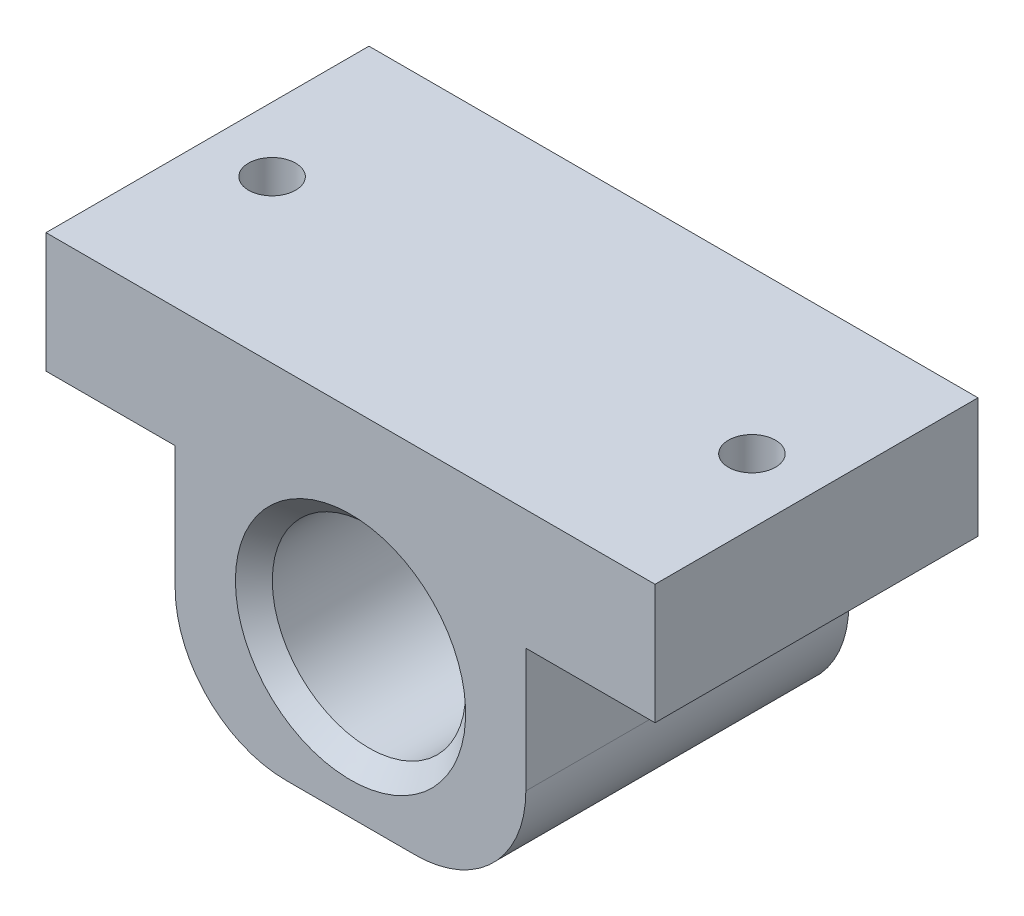
ISO-10303-21;
HEADER;
FILE_DESCRIPTION(('STEP AP214'),'2;1');
FILE_NAME('part.step','',(''),(''),'','','');
FILE_SCHEMA(('AUTOMOTIVE_DESIGN { 1 0 10303 214 1 1 1 1 }'));
ENDSEC;
DATA;
#1=APPLICATION_CONTEXT('core data for automotive mechanical design processes');
#2=APPLICATION_PROTOCOL_DEFINITION('international standard','automotive_design',2000,#1);
#3=PRODUCT_CONTEXT('',#1,'mechanical');
#4=PRODUCT('Part','Part','',(#3));
#5=PRODUCT_RELATED_PRODUCT_CATEGORY('part','',(#4));
#6=PRODUCT_DEFINITION_FORMATION('','',#4);
#7=PRODUCT_DEFINITION_CONTEXT('part definition',#1,'design');
#8=PRODUCT_DEFINITION('design','',#6,#7);
#9=PRODUCT_DEFINITION_SHAPE('','',#8);
#10=(LENGTH_UNIT() NAMED_UNIT(*) SI_UNIT(.MILLI.,.METRE.));
#11=(NAMED_UNIT(*) PLANE_ANGLE_UNIT() SI_UNIT($,.RADIAN.));
#12=(NAMED_UNIT(*) SI_UNIT($,.STERADIAN.) SOLID_ANGLE_UNIT());
#13=UNCERTAINTY_MEASURE_WITH_UNIT(LENGTH_MEASURE(1.E-05),#10,'distance_accuracy_value','');
#14=(GEOMETRIC_REPRESENTATION_CONTEXT(3) GLOBAL_UNCERTAINTY_ASSIGNED_CONTEXT((#13)) GLOBAL_UNIT_ASSIGNED_CONTEXT((#10,
#11,#12)) REPRESENTATION_CONTEXT('',''));
#15=CARTESIAN_POINT('',(0.,0.,0.));
#16=DIRECTION('',(0.,0.,1.));
#17=DIRECTION('',(1.,0.,0.));
#18=AXIS2_PLACEMENT_3D('',#15,#16,#17);
#19=CARTESIAN_POINT('',(7.,-4.,35.));
#20=DIRECTION('',(0.,0.,-1.));
#21=DIRECTION('',(-1.,0.,0.));
#22=AXIS2_PLACEMENT_3D('',#19,#20,#21);
#23=PLANE('',#22);
#24=CARTESIAN_POINT('',(0.,0.,35.));
#25=DIRECTION('',(0.,0.,-1.));
#26=DIRECTION('',(-1.,0.,0.));
#27=AXIS2_PLACEMENT_3D('',#24,#25,#26);
#28=CIRCLE('',#27,12.475);
#29=CARTESIAN_POINT('',(-12.475,0.,35.));
#30=VERTEX_POINT('',#29);
#31=EDGE_CURVE('E52',#30,#30,#28,.T.);
#32=ORIENTED_EDGE('',*,*,#31,.T.);
#33=EDGE_LOOP('',(#32));
#34=FACE_BOUND('',#33,.T.);
#35=DIRECTION('',(0.,1.,0.));
#36=VECTOR('',#35,1.);
#37=CARTESIAN_POINT('',(33.,22.4,35.));
#38=LINE('',#37,#36);
#39=CARTESIAN_POINT('',(33.,9.4,35.));
#40=VERTEX_POINT('',#39);
#41=CARTESIAN_POINT('',(33.,22.4,35.));
#42=VERTEX_POINT('',#41);
#43=EDGE_CURVE('E185',#40,#42,#38,.T.);
#44=ORIENTED_EDGE('',*,*,#43,.T.);
#45=DIRECTION('',(-1.,0.,0.));
#46=VECTOR('',#45,1.);
#47=CARTESIAN_POINT('',(-33.,22.4,35.));
#48=LINE('',#47,#46);
#49=CARTESIAN_POINT('',(-33.,22.4,35.));
#50=VERTEX_POINT('',#49);
#51=EDGE_CURVE('E110',#42,#50,#48,.T.);
#52=ORIENTED_EDGE('',*,*,#51,.T.);
#53=DIRECTION('',(0.,-1.,0.));
#54=VECTOR('',#53,1.);
#55=CARTESIAN_POINT('',(-33.,9.39999999999999,35.));
#56=LINE('',#55,#54);
#57=CARTESIAN_POINT('',(-33.,9.39999999999999,35.));
#58=VERTEX_POINT('',#57);
#59=EDGE_CURVE('E310',#50,#58,#56,.T.);
#60=ORIENTED_EDGE('',*,*,#59,.T.);
#61=DIRECTION('',(1.,0.,0.));
#62=VECTOR('',#61,1.);
#63=CARTESIAN_POINT('',(-19.,9.39999999999999,35.));
#64=LINE('',#63,#62);
#65=CARTESIAN_POINT('',(-19.,9.39999999999999,35.));
#66=VERTEX_POINT('',#65);
#67=EDGE_CURVE('E313',#58,#66,#64,.T.);
#68=ORIENTED_EDGE('',*,*,#67,.T.);
#69=DIRECTION('',(0.,-1.,0.));
#70=VECTOR('',#69,1.);
#71=CARTESIAN_POINT('',(-19.,-4.,35.));
#72=LINE('',#71,#70);
#73=CARTESIAN_POINT('',(-19.,-4.,35.));
#74=VERTEX_POINT('',#73);
#75=EDGE_CURVE('E316',#66,#74,#72,.T.);
#76=ORIENTED_EDGE('',*,*,#75,.T.);
#77=CARTESIAN_POINT('',(-7.,-4.,35.));
#78=DIRECTION('',(0.,0.,1.));
#79=DIRECTION('',(-1.,0.,0.));
#80=AXIS2_PLACEMENT_3D('',#77,#78,#79);
#81=CIRCLE('',#80,12.);
#82=CARTESIAN_POINT('',(-6.99999999999999,-16.,35.));
#83=VERTEX_POINT('',#82);
#84=EDGE_CURVE('E319',#74,#83,#81,.T.);
#85=ORIENTED_EDGE('',*,*,#84,.T.);
#86=DIRECTION('',(1.,0.,0.));
#87=VECTOR('',#86,1.);
#88=CARTESIAN_POINT('',(7.,-16.,35.));
#89=LINE('',#88,#87);
#90=CARTESIAN_POINT('',(7.,-16.,35.));
#91=VERTEX_POINT('',#90);
#92=EDGE_CURVE('E134',#83,#91,#89,.T.);
#93=ORIENTED_EDGE('',*,*,#92,.T.);
#94=CARTESIAN_POINT('',(7.,-4.,35.));
#95=DIRECTION('',(0.,0.,1.));
#96=DIRECTION('',(-1.,0.,0.));
#97=AXIS2_PLACEMENT_3D('',#94,#95,#96);
#98=CIRCLE('',#97,12.);
#99=CARTESIAN_POINT('',(19.,-4.,35.));
#100=VERTEX_POINT('',#99);
#101=EDGE_CURVE('E129',#91,#100,#98,.T.);
#102=ORIENTED_EDGE('',*,*,#101,.T.);
#103=DIRECTION('',(0.,1.,0.));
#104=VECTOR('',#103,1.);
#105=CARTESIAN_POINT('',(19.,9.4,35.));
#106=LINE('',#105,#104);
#107=CARTESIAN_POINT('',(19.,9.4,35.));
#108=VERTEX_POINT('',#107);
#109=EDGE_CURVE('E132',#100,#108,#106,.T.);
#110=ORIENTED_EDGE('',*,*,#109,.T.);
#111=DIRECTION('',(1.,0.,0.));
#112=VECTOR('',#111,1.);
#113=CARTESIAN_POINT('',(33.,9.4,35.));
#114=LINE('',#113,#112);
#115=EDGE_CURVE('E60',#108,#40,#114,.T.);
#116=ORIENTED_EDGE('',*,*,#115,.T.);
#117=EDGE_LOOP('',(#44,#52,#60,#68,#76,#85,#93,#102,#110,#116));
#118=FACE_BOUND('',#117,.T.);
#119=ADVANCED_FACE('F41',(#34,#118),#23,.F.);
#120=CARTESIAN_POINT('',(7.,-4.,0.));
#121=DIRECTION('',(0.,0.,-1.));
#122=DIRECTION('',(-1.,0.,0.));
#123=AXIS2_PLACEMENT_3D('',#120,#121,#122);
#124=PLANE('',#123);
#125=CARTESIAN_POINT('',(0.,0.,0.));
#126=DIRECTION('',(0.,0.,-1.));
#127=DIRECTION('',(-1.,0.,0.));
#128=AXIS2_PLACEMENT_3D('',#125,#126,#127);
#129=CIRCLE('',#128,12.475);
#130=CARTESIAN_POINT('',(-12.475,0.,0.));
#131=VERTEX_POINT('',#130);
#132=EDGE_CURVE('E11',#131,#131,#129,.F.);
#133=ORIENTED_EDGE('',*,*,#132,.T.);
#134=EDGE_LOOP('',(#133));
#135=FACE_BOUND('',#134,.T.);
#136=DIRECTION('',(0.,1.,0.));
#137=VECTOR('',#136,1.);
#138=CARTESIAN_POINT('',(33.,22.4,0.));
#139=LINE('',#138,#137);
#140=CARTESIAN_POINT('',(33.,9.4,0.));
#141=VERTEX_POINT('',#140);
#142=CARTESIAN_POINT('',(33.,22.4,0.));
#143=VERTEX_POINT('',#142);
#144=EDGE_CURVE('E156',#141,#143,#139,.T.);
#145=ORIENTED_EDGE('',*,*,#144,.F.);
#146=DIRECTION('',(1.,0.,0.));
#147=VECTOR('',#146,1.);
#148=CARTESIAN_POINT('',(33.,9.4,0.));
#149=LINE('',#148,#147);
#150=CARTESIAN_POINT('',(19.,9.4,0.));
#151=VERTEX_POINT('',#150);
#152=EDGE_CURVE('E101',#151,#141,#149,.T.);
#153=ORIENTED_EDGE('',*,*,#152,.F.);
#154=DIRECTION('',(0.,1.,0.));
#155=VECTOR('',#154,1.);
#156=CARTESIAN_POINT('',(19.,9.4,0.));
#157=LINE('',#156,#155);
#158=CARTESIAN_POINT('',(19.,-4.,0.));
#159=VERTEX_POINT('',#158);
#160=EDGE_CURVE('E95',#159,#151,#157,.T.);
#161=ORIENTED_EDGE('',*,*,#160,.F.);
#162=CARTESIAN_POINT('',(7.,-4.,0.));
#163=DIRECTION('',(0.,0.,1.));
#164=DIRECTION('',(-1.,0.,0.));
#165=AXIS2_PLACEMENT_3D('',#162,#163,#164);
#166=CIRCLE('',#165,12.);
#167=CARTESIAN_POINT('',(7.,-16.,0.));
#168=VERTEX_POINT('',#167);
#169=EDGE_CURVE('E143',#168,#159,#166,.T.);
#170=ORIENTED_EDGE('',*,*,#169,.F.);
#171=DIRECTION('',(1.,0.,0.));
#172=VECTOR('',#171,1.);
#173=CARTESIAN_POINT('',(7.,-16.,0.));
#174=LINE('',#173,#172);
#175=CARTESIAN_POINT('',(-6.99999999999999,-16.,0.));
#176=VERTEX_POINT('',#175);
#177=EDGE_CURVE('E176',#176,#168,#174,.T.);
#178=ORIENTED_EDGE('',*,*,#177,.F.);
#179=CARTESIAN_POINT('',(-7.,-4.,0.));
#180=DIRECTION('',(0.,0.,1.));
#181=DIRECTION('',(-1.,0.,0.));
#182=AXIS2_PLACEMENT_3D('',#179,#180,#181);
#183=CIRCLE('',#182,12.);
#184=CARTESIAN_POINT('',(-19.,-4.,0.));
#185=VERTEX_POINT('',#184);
#186=EDGE_CURVE('E173',#185,#176,#183,.T.);
#187=ORIENTED_EDGE('',*,*,#186,.F.);
#188=DIRECTION('',(0.,-1.,0.));
#189=VECTOR('',#188,1.);
#190=CARTESIAN_POINT('',(-19.,-4.,0.));
#191=LINE('',#190,#189);
#192=CARTESIAN_POINT('',(-19.,9.39999999999999,0.));
#193=VERTEX_POINT('',#192);
#194=EDGE_CURVE('E170',#193,#185,#191,.T.);
#195=ORIENTED_EDGE('',*,*,#194,.F.);
#196=DIRECTION('',(1.,0.,0.));
#197=VECTOR('',#196,1.);
#198=CARTESIAN_POINT('',(-19.,9.39999999999999,0.));
#199=LINE('',#198,#197);
#200=CARTESIAN_POINT('',(-33.,9.39999999999999,0.));
#201=VERTEX_POINT('',#200);
#202=EDGE_CURVE('E167',#201,#193,#199,.T.);
#203=ORIENTED_EDGE('',*,*,#202,.F.);
#204=DIRECTION('',(0.,-1.,0.));
#205=VECTOR('',#204,1.);
#206=CARTESIAN_POINT('',(-33.,9.39999999999999,0.));
#207=LINE('',#206,#205);
#208=CARTESIAN_POINT('',(-33.,22.4,0.));
#209=VERTEX_POINT('',#208);
#210=EDGE_CURVE('E164',#209,#201,#207,.T.);
#211=ORIENTED_EDGE('',*,*,#210,.F.);
#212=DIRECTION('',(-1.,0.,0.));
#213=VECTOR('',#212,1.);
#214=CARTESIAN_POINT('',(-33.,22.4,0.));
#215=LINE('',#214,#213);
#216=EDGE_CURVE('E160',#143,#209,#215,.T.);
#217=ORIENTED_EDGE('',*,*,#216,.F.);
#218=EDGE_LOOP('',(#145,#153,#161,#170,#178,#187,#195,#203,#211,#217));
#219=FACE_BOUND('',#218,.T.);
#220=ADVANCED_FACE('F247',(#135,#219),#124,.T.);
#221=CARTESIAN_POINT('',(33.,22.4,35.));
#222=DIRECTION('',(-1.,0.,0.));
#223=DIRECTION('',(0.,0.,1.));
#224=AXIS2_PLACEMENT_3D('',#221,#222,#223);
#225=PLANE('',#224);
#226=ORIENTED_EDGE('',*,*,#144,.T.);
#227=DIRECTION('',(0.,0.,-1.));
#228=VECTOR('',#227,1.);
#229=CARTESIAN_POINT('',(33.,22.4,35.));
#230=LINE('',#229,#228);
#231=EDGE_CURVE('E212',#42,#143,#230,.T.);
#232=ORIENTED_EDGE('',*,*,#231,.F.);
#233=ORIENTED_EDGE('',*,*,#43,.F.);
#234=DIRECTION('',(0.,0.,-1.));
#235=VECTOR('',#234,1.);
#236=CARTESIAN_POINT('',(33.,9.4,35.));
#237=LINE('',#236,#235);
#238=EDGE_CURVE('E152',#40,#141,#237,.T.);
#239=ORIENTED_EDGE('',*,*,#238,.T.);
#240=EDGE_LOOP('',(#226,#232,#233,#239));
#241=FACE_BOUND('',#240,.T.);
#242=ADVANCED_FACE('F250',(#241),#225,.F.);
#243=CARTESIAN_POINT('',(-33.,22.4,35.));
#244=DIRECTION('',(0.,-1.,0.));
#245=DIRECTION('',(1.,0.,0.));
#246=AXIS2_PLACEMENT_3D('',#243,#244,#245);
#247=PLANE('',#246);
#248=CARTESIAN_POINT('',(-26.,22.4,17.5));
#249=DIRECTION('',(0.,-1.,0.));
#250=DIRECTION('',(1.,0.,0.));
#251=AXIS2_PLACEMENT_3D('',#248,#249,#250);
#252=CIRCLE('',#251,2.55);
#253=CARTESIAN_POINT('',(-23.45,22.4,17.5));
#254=VERTEX_POINT('',#253);
#255=EDGE_CURVE('E161',#254,#254,#252,.T.);
#256=ORIENTED_EDGE('',*,*,#255,.T.);
#257=EDGE_LOOP('',(#256));
#258=FACE_BOUND('',#257,.T.);
#259=CARTESIAN_POINT('',(26.,22.4,17.5));
#260=DIRECTION('',(0.,-1.,0.));
#261=DIRECTION('',(1.,0.,0.));
#262=AXIS2_PLACEMENT_3D('',#259,#260,#261);
#263=CIRCLE('',#262,2.55);
#264=CARTESIAN_POINT('',(28.55,22.4,17.5));
#265=VERTEX_POINT('',#264);
#266=EDGE_CURVE('E298',#265,#265,#263,.T.);
#267=ORIENTED_EDGE('',*,*,#266,.T.);
#268=EDGE_LOOP('',(#267));
#269=FACE_BOUND('',#268,.T.);
#270=ORIENTED_EDGE('',*,*,#216,.T.);
#271=DIRECTION('',(0.,0.,-1.));
#272=VECTOR('',#271,1.);
#273=CARTESIAN_POINT('',(-33.,22.4,35.));
#274=LINE('',#273,#272);
#275=EDGE_CURVE('E208',#50,#209,#274,.T.);
#276=ORIENTED_EDGE('',*,*,#275,.F.);
#277=ORIENTED_EDGE('',*,*,#51,.F.);
#278=ORIENTED_EDGE('',*,*,#231,.T.);
#279=EDGE_LOOP('',(#270,#276,#277,#278));
#280=FACE_BOUND('',#279,.T.);
#281=ADVANCED_FACE('F351',(#258,#269,#280),#247,.F.);
#282=CARTESIAN_POINT('',(-33.,9.39999999999999,35.));
#283=DIRECTION('',(1.,0.,0.));
#284=DIRECTION('',(0.,0.,-1.));
#285=AXIS2_PLACEMENT_3D('',#282,#283,#284);
#286=PLANE('',#285);
#287=ORIENTED_EDGE('',*,*,#210,.T.);
#288=DIRECTION('',(0.,0.,-1.));
#289=VECTOR('',#288,1.);
#290=CARTESIAN_POINT('',(-33.,9.39999999999999,35.));
#291=LINE('',#290,#289);
#292=EDGE_CURVE('E204',#58,#201,#291,.T.);
#293=ORIENTED_EDGE('',*,*,#292,.F.);
#294=ORIENTED_EDGE('',*,*,#59,.F.);
#295=ORIENTED_EDGE('',*,*,#275,.T.);
#296=EDGE_LOOP('',(#287,#293,#294,#295));
#297=FACE_BOUND('',#296,.T.);
#298=ADVANCED_FACE('F349',(#297),#286,.F.);
#299=CARTESIAN_POINT('',(-19.,9.39999999999999,35.));
#300=DIRECTION('',(0.,1.,0.));
#301=DIRECTION('',(-1.,0.,0.));
#302=AXIS2_PLACEMENT_3D('',#299,#300,#301);
#303=PLANE('',#302);
#304=CARTESIAN_POINT('',(-26.,9.39999999999999,17.5));
#305=DIRECTION('',(0.,-1.,0.));
#306=DIRECTION('',(1.,0.,0.));
#307=AXIS2_PLACEMENT_3D('',#304,#305,#306);
#308=CIRCLE('',#307,2.55);
#309=CARTESIAN_POINT('',(-23.45,9.39999999999999,17.5));
#310=VERTEX_POINT('',#309);
#311=EDGE_CURVE('E294',#310,#310,#308,.T.);
#312=ORIENTED_EDGE('',*,*,#311,.F.);
#313=EDGE_LOOP('',(#312));
#314=FACE_BOUND('',#313,.T.);
#315=ORIENTED_EDGE('',*,*,#202,.T.);
#316=DIRECTION('',(0.,0.,-1.));
#317=VECTOR('',#316,1.);
#318=CARTESIAN_POINT('',(-19.,9.39999999999999,35.));
#319=LINE('',#318,#317);
#320=EDGE_CURVE('E200',#66,#193,#319,.T.);
#321=ORIENTED_EDGE('',*,*,#320,.F.);
#322=ORIENTED_EDGE('',*,*,#67,.F.);
#323=ORIENTED_EDGE('',*,*,#292,.T.);
#324=EDGE_LOOP('',(#315,#321,#322,#323));
#325=FACE_BOUND('',#324,.T.);
#326=ADVANCED_FACE('F346',(#314,#325),#303,.F.);
#327=CARTESIAN_POINT('',(-19.,-4.,35.));
#328=DIRECTION('',(1.,0.,0.));
#329=DIRECTION('',(0.,1.,0.));
#330=AXIS2_PLACEMENT_3D('',#327,#328,#329);
#331=PLANE('',#330);
#332=ORIENTED_EDGE('',*,*,#194,.T.);
#333=DIRECTION('',(0.,0.,-1.));
#334=VECTOR('',#333,1.);
#335=CARTESIAN_POINT('',(-19.,-4.,35.));
#336=LINE('',#335,#334);
#337=EDGE_CURVE('E196',#74,#185,#336,.T.);
#338=ORIENTED_EDGE('',*,*,#337,.F.);
#339=ORIENTED_EDGE('',*,*,#75,.F.);
#340=ORIENTED_EDGE('',*,*,#320,.T.);
#341=EDGE_LOOP('',(#332,#338,#339,#340));
#342=FACE_BOUND('',#341,.T.);
#343=ADVANCED_FACE('F342',(#342),#331,.F.);
#344=CARTESIAN_POINT('',(-7.,-4.,35.));
#345=DIRECTION('',(0.,0.,-1.));
#346=DIRECTION('',(-1.,0.,0.));
#347=AXIS2_PLACEMENT_3D('',#344,#345,#346);
#348=CYLINDRICAL_SURFACE('',#347,12.);
#349=ORIENTED_EDGE('',*,*,#186,.T.);
#350=DIRECTION('',(0.,0.,-1.));
#351=VECTOR('',#350,1.);
#352=CARTESIAN_POINT('',(-6.99999999999999,-16.,35.));
#353=LINE('',#352,#351);
#354=EDGE_CURVE('E192',#83,#176,#353,.T.);
#355=ORIENTED_EDGE('',*,*,#354,.F.);
#356=ORIENTED_EDGE('',*,*,#84,.F.);
#357=ORIENTED_EDGE('',*,*,#337,.T.);
#358=EDGE_LOOP('',(#349,#355,#356,#357));
#359=FACE_BOUND('',#358,.T.);
#360=ADVANCED_FACE('F330',(#359),#348,.T.);
#361=CARTESIAN_POINT('',(7.,-16.,35.));
#362=DIRECTION('',(0.,1.,0.));
#363=DIRECTION('',(0.,0.,1.));
#364=AXIS2_PLACEMENT_3D('',#361,#362,#363);
#365=PLANE('',#364);
#366=CARTESIAN_POINT('',(0.,-16.,17.5));
#367=DIRECTION('',(0.,-1.,0.));
#368=DIRECTION('',(0.,0.,-1.));
#369=AXIS2_PLACEMENT_3D('',#366,#367,#368);
#370=CIRCLE('',#369,1.375);
#371=CARTESIAN_POINT('',(0.,-16.,16.125));
#372=VERTEX_POINT('',#371);
#373=EDGE_CURVE('E290',#372,#372,#370,.T.);
#374=ORIENTED_EDGE('',*,*,#373,.F.);
#375=EDGE_LOOP('',(#374));
#376=FACE_BOUND('',#375,.T.);
#377=ORIENTED_EDGE('',*,*,#177,.T.);
#378=DIRECTION('',(0.,0.,-1.));
#379=VECTOR('',#378,1.);
#380=CARTESIAN_POINT('',(7.,-16.,35.));
#381=LINE('',#380,#379);
#382=EDGE_CURVE('E145',#91,#168,#381,.T.);
#383=ORIENTED_EDGE('',*,*,#382,.F.);
#384=ORIENTED_EDGE('',*,*,#92,.F.);
#385=ORIENTED_EDGE('',*,*,#354,.T.);
#386=EDGE_LOOP('',(#377,#383,#384,#385));
#387=FACE_BOUND('',#386,.T.);
#388=ADVANCED_FACE('F327',(#376,#387),#365,.F.);
#389=CARTESIAN_POINT('',(7.,-4.,35.));
#390=DIRECTION('',(0.,0.,-1.));
#391=DIRECTION('',(-1.,0.,0.));
#392=AXIS2_PLACEMENT_3D('',#389,#390,#391);
#393=CYLINDRICAL_SURFACE('',#392,12.);
#394=ORIENTED_EDGE('',*,*,#169,.T.);
#395=DIRECTION('',(0.,0.,-1.));
#396=VECTOR('',#395,1.);
#397=CARTESIAN_POINT('',(19.,-4.,35.));
#398=LINE('',#397,#396);
#399=EDGE_CURVE('E140',#100,#159,#398,.T.);
#400=ORIENTED_EDGE('',*,*,#399,.F.);
#401=ORIENTED_EDGE('',*,*,#101,.F.);
#402=ORIENTED_EDGE('',*,*,#382,.T.);
#403=EDGE_LOOP('',(#394,#400,#401,#402));
#404=FACE_BOUND('',#403,.T.);
#405=ADVANCED_FACE('F141',(#404),#393,.T.);
#406=CARTESIAN_POINT('',(19.,9.4,35.));
#407=DIRECTION('',(-1.,0.,0.));
#408=DIRECTION('',(0.,-1.,0.));
#409=AXIS2_PLACEMENT_3D('',#406,#407,#408);
#410=PLANE('',#409);
#411=ORIENTED_EDGE('',*,*,#160,.T.);
#412=DIRECTION('',(0.,0.,-1.));
#413=VECTOR('',#412,1.);
#414=CARTESIAN_POINT('',(19.,9.4,35.));
#415=LINE('',#414,#413);
#416=EDGE_CURVE('E146',#108,#151,#415,.T.);
#417=ORIENTED_EDGE('',*,*,#416,.F.);
#418=ORIENTED_EDGE('',*,*,#109,.F.);
#419=ORIENTED_EDGE('',*,*,#399,.T.);
#420=EDGE_LOOP('',(#411,#417,#418,#419));
#421=FACE_BOUND('',#420,.T.);
#422=ADVANCED_FACE('F148',(#421),#410,.F.);
#423=CARTESIAN_POINT('',(33.,9.4,35.));
#424=DIRECTION('',(0.,1.,0.));
#425=DIRECTION('',(-1.,0.,0.));
#426=AXIS2_PLACEMENT_3D('',#423,#424,#425);
#427=PLANE('',#426);
#428=CARTESIAN_POINT('',(26.,9.4,17.5));
#429=DIRECTION('',(0.,-1.,0.));
#430=DIRECTION('',(1.,0.,0.));
#431=AXIS2_PLACEMENT_3D('',#428,#429,#430);
#432=CIRCLE('',#431,2.55);
#433=CARTESIAN_POINT('',(28.55,9.4,17.5));
#434=VERTEX_POINT('',#433);
#435=EDGE_CURVE('E302',#434,#434,#432,.T.);
#436=ORIENTED_EDGE('',*,*,#435,.F.);
#437=EDGE_LOOP('',(#436));
#438=FACE_BOUND('',#437,.T.);
#439=ORIENTED_EDGE('',*,*,#152,.T.);
#440=ORIENTED_EDGE('',*,*,#238,.F.);
#441=ORIENTED_EDGE('',*,*,#115,.F.);
#442=ORIENTED_EDGE('',*,*,#416,.T.);
#443=EDGE_LOOP('',(#439,#440,#441,#442));
#444=FACE_BOUND('',#443,.T.);
#445=ADVANCED_FACE('F237',(#438,#444),#427,.F.);
#446=CARTESIAN_POINT('',(0.,0.,35.));
#447=DIRECTION('',(0.,0.,-1.));
#448=DIRECTION('',(-1.,0.,0.));
#449=AXIS2_PLACEMENT_3D('',#446,#447,#448);
#450=CYLINDRICAL_SURFACE('',#449,10.475);
#451=CARTESIAN_POINT('',(0.,-10.475,16.125));
#452=CARTESIAN_POINT('',(0.0768797608929018,-10.4749988843589,16.1250032456343));
#453=CARTESIAN_POINT('',(0.153806763021997,-10.4741447053009,16.1314695625016));
#454=CARTESIAN_POINT('',(0.305517904012938,-10.4708193883126,16.1571616192263));
#455=CARTESIAN_POINT('',(0.380299758173488,-10.4683465886705,16.1764004719428));
#456=CARTESIAN_POINT('',(0.52550248851182,-10.4620624443766,16.2270590805601));
#457=CARTESIAN_POINT('',(0.595926345950208,-10.4582520269533,16.2584704001441));
#458=CARTESIAN_POINT('',(0.7304904098568,-10.4497157984456,16.3325633091741));
#459=CARTESIAN_POINT('',(0.794631643511295,-10.4449901373775,16.3752430520426));
#460=CARTESIAN_POINT('',(0.915210315416687,-10.4351185943113,16.4709369361339));
#461=CARTESIAN_POINT('',(0.971604280169565,-10.4299705808041,16.524005641676));
#462=CARTESIAN_POINT('',(1.0747130228934,-10.4198516127151,16.6388537825317));
#463=CARTESIAN_POINT('',(1.12142729342876,-10.4148806674269,16.700633674224));
#464=CARTESIAN_POINT('',(1.20401434404614,-10.405657780537,16.8314353772215));
#465=CARTESIAN_POINT('',(1.23984606589152,-10.4014085879215,16.900483322894));
#466=CARTESIAN_POINT('',(1.29938864263344,-10.3941387023636,17.0436818912254));
#467=CARTESIAN_POINT('',(1.32310000359028,-10.3911179581309,17.1178323006949));
#468=CARTESIAN_POINT('',(1.3575959500029,-10.3866675152573,17.268678168445));
#469=CARTESIAN_POINT('',(1.36845420651595,-10.3852287524743,17.3453565072417));
#470=CARTESIAN_POINT('',(1.37716374371022,-10.3840774970086,17.4994595005429));
#471=CARTESIAN_POINT('',(1.37501559946924,-10.3843649280022,17.5768841218993));
#472=CARTESIAN_POINT('',(1.35783372392502,-10.386625289309,17.7297668295108));
#473=CARTESIAN_POINT('',(1.34288135285262,-10.3885875770403,17.8052342392997));
#474=CARTESIAN_POINT('',(1.30064250645411,-10.3939599476121,17.952579461615));
#475=CARTESIAN_POINT('',(1.27335575783955,-10.3973700625316,18.024457194567));
#476=CARTESIAN_POINT('',(1.20713594274332,-10.4052658497608,18.1628342519609));
#477=CARTESIAN_POINT('',(1.16816773043682,-10.4097547596244,18.2293165652245));
#478=CARTESIAN_POINT('',(1.07971626749914,-10.4192998885286,18.3548291136468));
#479=CARTESIAN_POINT('',(1.03023248681097,-10.4243561361608,18.4138589729114));
#480=CARTESIAN_POINT('',(0.921704653809231,-10.4345134752018,18.5232630512956));
#481=CARTESIAN_POINT('',(0.86259051384641,-10.439614614323,18.5735677657646));
#482=CARTESIAN_POINT('',(0.736720741272371,-10.4492509248022,18.6635517011507));
#483=CARTESIAN_POINT('',(0.669965087814806,-10.4537860946161,18.70323089308));
#484=CARTESIAN_POINT('',(0.530652082492773,-10.4617827096638,18.7708383078413));
#485=CARTESIAN_POINT('',(0.45809247853574,-10.4652437355331,18.7987619426131));
#486=CARTESIAN_POINT('',(0.30925867949211,-10.4706983784867,18.842009194829));
#487=CARTESIAN_POINT('',(0.23298467651264,-10.472692071375,18.8573334631753));
#488=CARTESIAN_POINT('',(0.0794879297532048,-10.4749775174955,18.87485635313));
#489=CARTESIAN_POINT('',(0.00227628856159159,-10.4752816794147,18.8771506754147));
#490=CARTESIAN_POINT('',(-0.151430435959432,-10.4741873601655,18.8688014436735));
#491=CARTESIAN_POINT('',(-0.227925536112698,-10.4727889190744,18.8581581941834));
#492=CARTESIAN_POINT('',(-0.377743626346262,-10.4684542367865,18.8243154665409));
#493=CARTESIAN_POINT('',(-0.451077153228519,-10.4655236139902,18.8011618526829));
#494=CARTESIAN_POINT('',(-0.592820702552277,-10.4584525202975,18.7430034852499));
#495=CARTESIAN_POINT('',(-0.661230542224839,-10.4543120045183,18.7079982920149));
#496=CARTESIAN_POINT('',(-0.791610685169482,-10.4452514495495,18.6269005400819));
#497=CARTESIAN_POINT('',(-0.853542354064135,-10.440327131404,18.5807463556419));
#498=CARTESIAN_POINT('',(-0.968814510521008,-10.4302625934103,18.4787476254473));
#499=CARTESIAN_POINT('',(-1.02215462036987,-10.4251223640824,18.4229026538777));
#500=CARTESIAN_POINT('',(-1.11907111623167,-10.4151668019354,18.302684948648));
#501=CARTESIAN_POINT('',(-1.16258389280676,-10.4103537192673,18.2382607208874));
#502=CARTESIAN_POINT('',(-1.23817048581528,-10.4016350953514,18.1029620098868));
#503=CARTESIAN_POINT('',(-1.27024455114094,-10.3977295343578,18.0320876670354));
#504=CARTESIAN_POINT('',(-1.32194129487691,-10.3912837302962,17.8861021773126));
#505=CARTESIAN_POINT('',(-1.34159927556661,-10.3887396194372,17.8110037098927));
#506=CARTESIAN_POINT('',(-1.3680192316348,-10.3852938733144,17.6585360067468));
#507=CARTESIAN_POINT('',(-1.37478187386346,-10.3843921531187,17.5811668886519));
#508=CARTESIAN_POINT('',(-1.3752060999598,-10.3843359290766,17.4269871850979));
#509=CARTESIAN_POINT('',(-1.36896763077494,-10.3851680958434,17.3501768604589));
#510=CARTESIAN_POINT('',(-1.34377896240489,-10.3884571518462,17.1987068339253));
#511=CARTESIAN_POINT('',(-1.32482876636624,-10.3909140406801,17.1240471314985));
#512=CARTESIAN_POINT('',(-1.27478680465886,-10.3971714624914,16.9790142509667));
#513=CARTESIAN_POINT('',(-1.24370036853159,-10.4009714056071,16.9086392069449));
#514=CARTESIAN_POINT('',(-1.17027817801538,-10.4094876855602,16.774088013093));
#515=CARTESIAN_POINT('',(-1.12794222570757,-10.4142040385201,16.7099119723524));
#516=CARTESIAN_POINT('',(-1.03285365407133,-10.4240651121294,16.5890702483433));
#517=CARTESIAN_POINT('',(-0.980026629675541,-10.4292127312445,16.5324633450818));
#518=CARTESIAN_POINT('',(-0.865611526244115,-10.4393310558577,16.4288802843127));
#519=CARTESIAN_POINT('',(-0.804021392329844,-10.4443017195184,16.3819063919936));
#520=CARTESIAN_POINT('',(-0.673530315821556,-10.4535292922392,16.2987529538144));
#521=CARTESIAN_POINT('',(-0.604599840695743,-10.4577831254559,16.2626194305264));
#522=CARTESIAN_POINT('',(-0.461630355306681,-10.4650669006687,16.202493355075));
#523=CARTESIAN_POINT('',(-0.387596933371472,-10.4680981573591,16.178487754126));
#524=CARTESIAN_POINT('',(-0.260993205022689,-10.471873515889,16.1489755225493));
#525=CARTESIAN_POINT('',(-0.209217618099713,-10.4730401640343,16.1399978113379));
#526=CARTESIAN_POINT('',(-0.104968692245794,-10.4746037837344,16.1280089671491));
#527=CARTESIAN_POINT('',(-0.0524953592089733,-10.4750007617867,16.1249977838024));
#528=CARTESIAN_POINT('',(0.,-10.475,16.125));
#529=B_SPLINE_CURVE_WITH_KNOTS('',3,(#451,#452,#453,#454,#455,#456,#457,#458,#459,#460,#461,
#462,#463,#464,#465,#466,#467,#468,#469,#470,#471,#472,#473,#474,#475,#476,#477,#478,#479,#480,
#481,#482,#483,#484,#485,#486,#487,#488,#489,#490,#491,#492,#493,#494,#495,#496,#497,#498,#499,
#500,#501,#502,#503,#504,#505,#506,#507,#508,#509,#510,#511,#512,#513,#514,#515,#516,#517,#518,
#519,#520,#521,#522,#523,#524,#525,#526,#527,#528),.UNSPECIFIED.,.T.,.F.,(4,2,2,2,2,2,2,2,2,2,2,
2,2,2,2,2,2,2,2,2,2,2,2,2,2,2,2,2,2,2,2,2,2,2,2,2,2,2,4),(0.,0.230447516734985,
0.461131987861298,0.691656864660796,0.922143988342909,1.15387581508414,1.38561978675906,
1.61822753274585,1.85082556588994,2.08208384325226,2.31333189560841,2.54312137008169,
2.77291593616887,3.00340894146133,3.23391356794383,3.46617756173561,3.69844218916773,
3.93079738298841,4.16314057223447,4.3937750479457,4.62440409488728,4.85419331249521,
5.08399105556233,5.31508929620977,5.54619769392889,5.77876165175987,6.01132054897736,
6.24321520608104,6.47509787100739,6.70520449950471,6.93531107104354,7.16531670641691,
7.39532638867314,7.62702968717018,7.85878740804559,8.09151556366231,8.32399278413531,
8.48134924774564,8.63870438295049),.UNSPECIFIED.);
#530=CARTESIAN_POINT('',(0.,-10.475,16.125));
#531=VERTEX_POINT('',#530);
#532=EDGE_CURVE('E282',#531,#531,#529,.T.);
#533=ORIENTED_EDGE('',*,*,#532,.T.);
#534=EDGE_LOOP('',(#533));
#535=FACE_BOUND('',#534,.T.);
#536=CARTESIAN_POINT('',(0.,0.,33.));
#537=DIRECTION('',(0.,0.,-1.));
#538=DIRECTION('',(-1.,0.,0.));
#539=AXIS2_PLACEMENT_3D('',#536,#537,#538);
#540=CIRCLE('',#539,10.475);
#541=CARTESIAN_POINT('',(-10.475,0.,33.));
#542=VERTEX_POINT('',#541);
#543=EDGE_CURVE('E219',#542,#542,#540,.F.);
#544=ORIENTED_EDGE('',*,*,#543,.T.);
#545=EDGE_LOOP('',(#544));
#546=FACE_BOUND('',#545,.T.);
#547=CARTESIAN_POINT('',(0.,0.,2.));
#548=DIRECTION('',(0.,0.,-1.));
#549=DIRECTION('',(-1.,0.,0.));
#550=AXIS2_PLACEMENT_3D('',#547,#548,#549);
#551=CIRCLE('',#550,10.475);
#552=CARTESIAN_POINT('',(-10.475,0.,2.));
#553=VERTEX_POINT('',#552);
#554=EDGE_CURVE('E215',#553,#553,#551,.T.);
#555=ORIENTED_EDGE('',*,*,#554,.T.);
#556=EDGE_LOOP('',(#555));
#557=FACE_BOUND('',#556,.T.);
#558=ADVANCED_FACE('F233',(#535,#546,#557),#450,.F.);
#559=CARTESIAN_POINT('',(26.,22.4,17.5));
#560=DIRECTION('',(0.,-1.,0.));
#561=DIRECTION('',(1.,0.,0.));
#562=AXIS2_PLACEMENT_3D('',#559,#560,#561);
#563=CYLINDRICAL_SURFACE('',#562,2.55);
#564=CARTESIAN_POINT('',(28.55,22.4,17.5));
#565=CARTESIAN_POINT('',(28.55,22.2645833333333,17.5));
#566=CARTESIAN_POINT('',(28.55,22.1291666666667,17.5));
#567=CARTESIAN_POINT('',(28.55,21.8583333333333,17.5));
#568=CARTESIAN_POINT('',(28.55,21.7229166666667,17.5));
#569=CARTESIAN_POINT('',(28.55,21.4520833333333,17.5));
#570=CARTESIAN_POINT('',(28.55,21.3166666666667,17.5));
#571=CARTESIAN_POINT('',(28.55,21.0458333333333,17.5));
#572=CARTESIAN_POINT('',(28.55,20.9104166666667,17.5));
#573=CARTESIAN_POINT('',(28.55,20.6395833333333,17.5));
#574=CARTESIAN_POINT('',(28.55,20.5041666666667,17.5));
#575=CARTESIAN_POINT('',(28.55,20.2333333333333,17.5));
#576=CARTESIAN_POINT('',(28.55,20.0979166666667,17.5));
#577=CARTESIAN_POINT('',(28.55,19.8270833333333,17.5));
#578=CARTESIAN_POINT('',(28.55,19.6916666666667,17.5));
#579=CARTESIAN_POINT('',(28.55,19.4208333333333,17.5));
#580=CARTESIAN_POINT('',(28.55,19.2854166666667,17.5));
#581=CARTESIAN_POINT('',(28.55,19.0145833333333,17.5));
#582=CARTESIAN_POINT('',(28.55,18.8791666666667,17.5));
#583=CARTESIAN_POINT('',(28.55,18.6083333333333,17.5));
#584=CARTESIAN_POINT('',(28.55,18.4729166666667,17.5));
#585=CARTESIAN_POINT('',(28.55,18.2020833333333,17.5));
#586=CARTESIAN_POINT('',(28.55,18.0666666666667,17.5));
#587=CARTESIAN_POINT('',(28.55,17.7958333333333,17.5));
#588=CARTESIAN_POINT('',(28.55,17.6604166666667,17.5));
#589=CARTESIAN_POINT('',(28.55,17.3895833333333,17.5));
#590=CARTESIAN_POINT('',(28.55,17.2541666666667,17.5));
#591=CARTESIAN_POINT('',(28.55,16.9833333333333,17.5));
#592=CARTESIAN_POINT('',(28.55,16.8479166666667,17.5));
#593=CARTESIAN_POINT('',(28.55,16.5770833333333,17.5));
#594=CARTESIAN_POINT('',(28.55,16.4416666666667,17.5));
#595=CARTESIAN_POINT('',(28.55,16.1708333333333,17.5));
#596=CARTESIAN_POINT('',(28.55,16.0354166666667,17.5));
#597=CARTESIAN_POINT('',(28.55,15.7645833333333,17.5));
#598=CARTESIAN_POINT('',(28.55,15.6291666666667,17.5));
#599=CARTESIAN_POINT('',(28.55,15.3583333333333,17.5));
#600=CARTESIAN_POINT('',(28.55,15.2229166666667,17.5));
#601=CARTESIAN_POINT('',(28.55,14.9520833333333,17.5));
#602=CARTESIAN_POINT('',(28.55,14.8166666666667,17.5));
#603=CARTESIAN_POINT('',(28.55,14.5458333333333,17.5));
#604=CARTESIAN_POINT('',(28.55,14.4104166666667,17.5));
#605=CARTESIAN_POINT('',(28.55,14.1395833333333,17.5));
#606=CARTESIAN_POINT('',(28.55,14.0041666666667,17.5));
#607=CARTESIAN_POINT('',(28.55,13.7333333333333,17.5));
#608=CARTESIAN_POINT('',(28.55,13.5979166666667,17.5));
#609=CARTESIAN_POINT('',(28.55,13.3270833333333,17.5));
#610=CARTESIAN_POINT('',(28.55,13.1916666666667,17.5));
#611=CARTESIAN_POINT('',(28.55,12.9208333333333,17.5));
#612=CARTESIAN_POINT('',(28.55,12.7854166666667,17.5));
#613=CARTESIAN_POINT('',(28.55,12.5145833333333,17.5));
#614=CARTESIAN_POINT('',(28.55,12.3791666666667,17.5));
#615=CARTESIAN_POINT('',(28.55,12.1083333333333,17.5));
#616=CARTESIAN_POINT('',(28.55,11.9729166666667,17.5));
#617=CARTESIAN_POINT('',(28.55,11.7020833333333,17.5));
#618=CARTESIAN_POINT('',(28.55,11.5666666666667,17.5));
#619=CARTESIAN_POINT('',(28.55,11.2958333333333,17.5));
#620=CARTESIAN_POINT('',(28.55,11.1604166666667,17.5));
#621=CARTESIAN_POINT('',(28.55,10.8895833333333,17.5));
#622=CARTESIAN_POINT('',(28.55,10.7541666666667,17.5));
#623=CARTESIAN_POINT('',(28.55,10.4833333333333,17.5));
#624=CARTESIAN_POINT('',(28.55,10.3479166666667,17.5));
#625=CARTESIAN_POINT('',(28.55,10.0770833333333,17.5));
#626=CARTESIAN_POINT('',(28.55,9.94166666666666,17.5));
#627=CARTESIAN_POINT('',(28.55,9.67083333333333,17.5));
#628=CARTESIAN_POINT('',(28.55,9.53541666666666,17.5));
#629=CARTESIAN_POINT('',(28.55,9.4,17.5));
#630=B_SPLINE_CURVE_WITH_KNOTS('',3,(#564,#565,#566,#567,#568,#569,#570,#571,#572,#573,#574,
#575,#576,#577,#578,#579,#580,#581,#582,#583,#584,#585,#586,#587,#588,#589,#590,#591,#592,#593,
#594,#595,#596,#597,#598,#599,#600,#601,#602,#603,#604,#605,#606,#607,#608,#609,#610,#611,#612,
#613,#614,#615,#616,#617,#618,#619,#620,#621,#622,#623,#624,#625,#626,#627,#628,#629),
.UNSPECIFIED.,.F.,.F.,(4,2,2,2,2,2,2,2,2,2,2,2,2,2,2,2,2,2,2,2,2,2,2,2,2,2,2,2,2,2,2,2,4),(0.,
0.406249999999997,0.812499999999997,1.21875,1.625,2.03125,2.4375,2.84375,3.25,3.65625,4.0625,
4.46875,4.875,5.28125,5.6875,6.09375,6.5,6.90625,7.3125,7.71875,8.125,8.53125,8.9375,9.34375,
9.75,10.15625,10.5625,10.96875,11.375,11.78125,12.1875,12.59375,13.),.UNSPECIFIED.);
#631=EDGE_CURVE('BSEAM236',#265,#434,#630,.T.);
#632=ORIENTED_EDGE('',*,*,#266,.F.);
#633=ORIENTED_EDGE('',*,*,#435,.T.);
#634=ORIENTED_EDGE('',*,*,#631,.T.);
#635=ORIENTED_EDGE('',*,*,#631,.F.);
#636=EDGE_LOOP('',(#632,#634,#633,#635));
#637=FACE_BOUND('',#636,.T.);
#638=ADVANCED_FACE('F236',(#637),#563,.F.);
#639=CARTESIAN_POINT('',(-26.,22.4,17.5));
#640=DIRECTION('',(0.,-1.,0.));
#641=DIRECTION('',(1.,0.,0.));
#642=AXIS2_PLACEMENT_3D('',#639,#640,#641);
#643=CYLINDRICAL_SURFACE('',#642,2.55);
#644=CARTESIAN_POINT('',(-23.45,22.4,17.5));
#645=CARTESIAN_POINT('',(-23.45,22.2645833333333,17.5));
#646=CARTESIAN_POINT('',(-23.45,22.1291666666667,17.5));
#647=CARTESIAN_POINT('',(-23.45,21.8583333333333,17.5));
#648=CARTESIAN_POINT('',(-23.45,21.7229166666667,17.5));
#649=CARTESIAN_POINT('',(-23.45,21.4520833333333,17.5));
#650=CARTESIAN_POINT('',(-23.45,21.3166666666667,17.5));
#651=CARTESIAN_POINT('',(-23.45,21.0458333333333,17.5));
#652=CARTESIAN_POINT('',(-23.45,20.9104166666667,17.5));
#653=CARTESIAN_POINT('',(-23.45,20.6395833333333,17.5));
#654=CARTESIAN_POINT('',(-23.45,20.5041666666667,17.5));
#655=CARTESIAN_POINT('',(-23.45,20.2333333333333,17.5));
#656=CARTESIAN_POINT('',(-23.45,20.0979166666667,17.5));
#657=CARTESIAN_POINT('',(-23.45,19.8270833333333,17.5));
#658=CARTESIAN_POINT('',(-23.45,19.6916666666667,17.5));
#659=CARTESIAN_POINT('',(-23.45,19.4208333333333,17.5));
#660=CARTESIAN_POINT('',(-23.45,19.2854166666667,17.5));
#661=CARTESIAN_POINT('',(-23.45,19.0145833333333,17.5));
#662=CARTESIAN_POINT('',(-23.45,18.8791666666667,17.5));
#663=CARTESIAN_POINT('',(-23.45,18.6083333333333,17.5));
#664=CARTESIAN_POINT('',(-23.45,18.4729166666667,17.5));
#665=CARTESIAN_POINT('',(-23.45,18.2020833333333,17.5));
#666=CARTESIAN_POINT('',(-23.45,18.0666666666667,17.5));
#667=CARTESIAN_POINT('',(-23.45,17.7958333333333,17.5));
#668=CARTESIAN_POINT('',(-23.45,17.6604166666667,17.5));
#669=CARTESIAN_POINT('',(-23.45,17.3895833333333,17.5));
#670=CARTESIAN_POINT('',(-23.45,17.2541666666667,17.5));
#671=CARTESIAN_POINT('',(-23.45,16.9833333333333,17.5));
#672=CARTESIAN_POINT('',(-23.45,16.8479166666667,17.5));
#673=CARTESIAN_POINT('',(-23.45,16.5770833333333,17.5));
#674=CARTESIAN_POINT('',(-23.45,16.4416666666667,17.5));
#675=CARTESIAN_POINT('',(-23.45,16.1708333333333,17.5));
#676=CARTESIAN_POINT('',(-23.45,16.0354166666667,17.5));
#677=CARTESIAN_POINT('',(-23.45,15.7645833333333,17.5));
#678=CARTESIAN_POINT('',(-23.45,15.6291666666667,17.5));
#679=CARTESIAN_POINT('',(-23.45,15.3583333333333,17.5));
#680=CARTESIAN_POINT('',(-23.45,15.2229166666667,17.5));
#681=CARTESIAN_POINT('',(-23.45,14.9520833333333,17.5));
#682=CARTESIAN_POINT('',(-23.45,14.8166666666667,17.5));
#683=CARTESIAN_POINT('',(-23.45,14.5458333333333,17.5));
#684=CARTESIAN_POINT('',(-23.45,14.4104166666667,17.5));
#685=CARTESIAN_POINT('',(-23.45,14.1395833333333,17.5));
#686=CARTESIAN_POINT('',(-23.45,14.0041666666667,17.5));
#687=CARTESIAN_POINT('',(-23.45,13.7333333333333,17.5));
#688=CARTESIAN_POINT('',(-23.45,13.5979166666667,17.5));
#689=CARTESIAN_POINT('',(-23.45,13.3270833333333,17.5));
#690=CARTESIAN_POINT('',(-23.45,13.1916666666667,17.5));
#691=CARTESIAN_POINT('',(-23.45,12.9208333333333,17.5));
#692=CARTESIAN_POINT('',(-23.45,12.7854166666667,17.5));
#693=CARTESIAN_POINT('',(-23.45,12.5145833333333,17.5));
#694=CARTESIAN_POINT('',(-23.45,12.3791666666667,17.5));
#695=CARTESIAN_POINT('',(-23.45,12.1083333333333,17.5));
#696=CARTESIAN_POINT('',(-23.45,11.9729166666667,17.5));
#697=CARTESIAN_POINT('',(-23.45,11.7020833333333,17.5));
#698=CARTESIAN_POINT('',(-23.45,11.5666666666667,17.5));
#699=CARTESIAN_POINT('',(-23.45,11.2958333333333,17.5));
#700=CARTESIAN_POINT('',(-23.45,11.1604166666667,17.5));
#701=CARTESIAN_POINT('',(-23.45,10.8895833333333,17.5));
#702=CARTESIAN_POINT('',(-23.45,10.7541666666667,17.5));
#703=CARTESIAN_POINT('',(-23.45,10.4833333333333,17.5));
#704=CARTESIAN_POINT('',(-23.45,10.3479166666667,17.5));
#705=CARTESIAN_POINT('',(-23.45,10.0770833333333,17.5));
#706=CARTESIAN_POINT('',(-23.45,9.94166666666666,17.5));
#707=CARTESIAN_POINT('',(-23.45,9.67083333333333,17.5));
#708=CARTESIAN_POINT('',(-23.45,9.53541666666666,17.5));
#709=CARTESIAN_POINT('',(-23.45,9.39999999999999,17.5));
#710=B_SPLINE_CURVE_WITH_KNOTS('',3,(#644,#645,#646,#647,#648,#649,#650,#651,#652,#653,#654,
#655,#656,#657,#658,#659,#660,#661,#662,#663,#664,#665,#666,#667,#668,#669,#670,#671,#672,#673,
#674,#675,#676,#677,#678,#679,#680,#681,#682,#683,#684,#685,#686,#687,#688,#689,#690,#691,#692,
#693,#694,#695,#696,#697,#698,#699,#700,#701,#702,#703,#704,#705,#706,#707,#708,#709),
.UNSPECIFIED.,.F.,.F.,(4,2,2,2,2,2,2,2,2,2,2,2,2,2,2,2,2,2,2,2,2,2,2,2,2,2,2,2,2,2,2,2,4),(0.,
0.406249999999997,0.812499999999997,1.21875,1.625,2.03125,2.4375,2.84375,3.25,3.65625,4.0625,
4.46875,4.875,5.28125,5.6875,6.09375,6.5,6.90625,7.3125,7.71875,8.125,8.53125,8.9375,9.34375,
9.75,10.15625,10.5625,10.96875,11.375,11.78125,12.1875,12.59375,13.),.UNSPECIFIED.);
#711=EDGE_CURVE('BSEAM230',#254,#310,#710,.T.);
#712=ORIENTED_EDGE('',*,*,#255,.F.);
#713=ORIENTED_EDGE('',*,*,#311,.T.);
#714=ORIENTED_EDGE('',*,*,#711,.T.);
#715=ORIENTED_EDGE('',*,*,#711,.F.);
#716=EDGE_LOOP('',(#712,#714,#713,#715));
#717=FACE_BOUND('',#716,.T.);
#718=ADVANCED_FACE('F230',(#717),#643,.F.);
#719=CARTESIAN_POINT('',(0.,0.,33.));
#720=DIRECTION('',(0.,0.,1.));
#721=DIRECTION('',(1.,0.,0.));
#722=AXIS2_PLACEMENT_3D('',#719,#720,#721);
#723=CONICAL_SURFACE('',#722,10.475,0.785398163397451);
#724=ORIENTED_EDGE('',*,*,#31,.F.);
#725=EDGE_LOOP('',(#724));
#726=FACE_BOUND('',#725,.T.);
#727=ORIENTED_EDGE('',*,*,#543,.F.);
#728=EDGE_LOOP('',(#727));
#729=FACE_BOUND('',#728,.T.);
#730=ADVANCED_FACE('F227',(#726,#729),#723,.F.);
#731=CARTESIAN_POINT('',(0.,0.,0.));
#732=DIRECTION('',(0.,0.,-1.));
#733=DIRECTION('',(-1.,0.,0.));
#734=AXIS2_PLACEMENT_3D('',#731,#732,#733);
#735=CONICAL_SURFACE('',#734,12.475,0.785398163397448);
#736=ORIENTED_EDGE('',*,*,#554,.F.);
#737=EDGE_LOOP('',(#736));
#738=FACE_BOUND('',#737,.T.);
#739=ORIENTED_EDGE('',*,*,#132,.F.);
#740=EDGE_LOOP('',(#739));
#741=FACE_BOUND('',#740,.T.);
#742=ADVANCED_FACE('F44',(#738,#741),#735,.F.);
#743=CARTESIAN_POINT('',(0.,22.401,17.5));
#744=DIRECTION('',(0.,-1.,0.));
#745=DIRECTION('',(0.,0.,-1.));
#746=AXIS2_PLACEMENT_3D('',#743,#744,#745);
#747=CYLINDRICAL_SURFACE('',#746,1.375);
#748=ORIENTED_EDGE('',*,*,#532,.F.);
#749=EDGE_LOOP('',(#748));
#750=FACE_BOUND('',#749,.T.);
#751=ORIENTED_EDGE('',*,*,#373,.T.);
#752=EDGE_LOOP('',(#751));
#753=FACE_BOUND('',#752,.T.);
#754=ADVANCED_FACE('F244',(#750,#753),#747,.F.);
#755=CLOSED_SHELL('',(#119,#220,#242,#281,#298,#326,#343,#360,#388,#405,#422,#445,#558,#638,
#718,#730,#742,#754));
#756=MANIFOLD_SOLID_BREP('B2',#755);
#757=ADVANCED_BREP_SHAPE_REPRESENTATION('',(#18,#756),#14);
#758=SHAPE_DEFINITION_REPRESENTATION(#9,#757);
ENDSEC;
END-ISO-10303-21;
